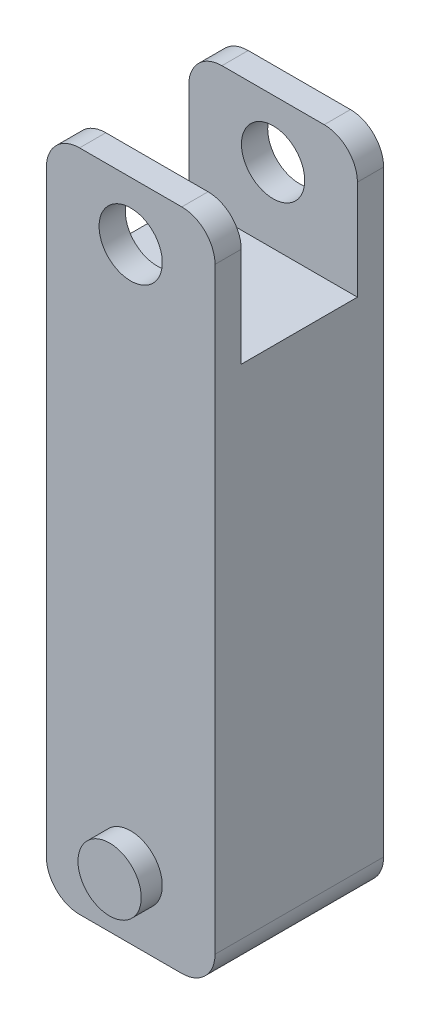
ISO-10303-21;
HEADER;
FILE_DESCRIPTION(('STEP AP214'),'2;1');
FILE_NAME('part.step','',(''),(''),'','','');
FILE_SCHEMA(('AUTOMOTIVE_DESIGN { 1 0 10303 214 1 1 1 1 }'));
ENDSEC;
DATA;
#1=APPLICATION_CONTEXT('core data for automotive mechanical design processes');
#2=APPLICATION_PROTOCOL_DEFINITION('international standard','automotive_design',2000,#1);
#3=PRODUCT_CONTEXT('',#1,'mechanical');
#4=PRODUCT('Part','Part','',(#3));
#5=PRODUCT_RELATED_PRODUCT_CATEGORY('part','',(#4));
#6=PRODUCT_DEFINITION_FORMATION('','',#4);
#7=PRODUCT_DEFINITION_CONTEXT('part definition',#1,'design');
#8=PRODUCT_DEFINITION('design','',#6,#7);
#9=PRODUCT_DEFINITION_SHAPE('','',#8);
#10=(LENGTH_UNIT() NAMED_UNIT(*) SI_UNIT(.MILLI.,.METRE.));
#11=(NAMED_UNIT(*) PLANE_ANGLE_UNIT() SI_UNIT($,.RADIAN.));
#12=(NAMED_UNIT(*) SI_UNIT($,.STERADIAN.) SOLID_ANGLE_UNIT());
#13=UNCERTAINTY_MEASURE_WITH_UNIT(LENGTH_MEASURE(1.E-05),#10,'distance_accuracy_value','');
#14=(GEOMETRIC_REPRESENTATION_CONTEXT(3) GLOBAL_UNCERTAINTY_ASSIGNED_CONTEXT((#13)) GLOBAL_UNIT_ASSIGNED_CONTEXT((#10,
#11,#12)) REPRESENTATION_CONTEXT('',''));
#15=CARTESIAN_POINT('',(0.,0.,0.));
#16=DIRECTION('',(0.,0.,1.));
#17=DIRECTION('',(1.,0.,0.));
#18=AXIS2_PLACEMENT_3D('',#15,#16,#17);
#19=CARTESIAN_POINT('',(0.,400.,0.));
#20=DIRECTION('',(0.,-1.,0.));
#21=DIRECTION('',(0.,0.,-1.));
#22=AXIS2_PLACEMENT_3D('',#19,#20,#21);
#23=PLANE('',#22);
#24=DIRECTION('',(-1.,0.,0.));
#25=VECTOR('',#24,1.);
#26=CARTESIAN_POINT('',(-50.8,400.,-50.8));
#27=LINE('',#26,#25);
#28=CARTESIAN_POINT('',(30.8,400.,-50.8));
#29=VERTEX_POINT('',#28);
#30=CARTESIAN_POINT('',(-30.8,400.,-50.8));
#31=VERTEX_POINT('',#30);
#32=EDGE_CURVE('E173',#29,#31,#27,.T.);
#33=ORIENTED_EDGE('',*,*,#32,.T.);
#34=DIRECTION('',(0.,0.,1.));
#35=VECTOR('',#34,1.);
#36=CARTESIAN_POINT('',(-30.8,400.,0.));
#37=LINE('',#36,#35);
#38=CARTESIAN_POINT('',(-30.8,400.,-35.));
#39=VERTEX_POINT('',#38);
#40=EDGE_CURVE('E243',#31,#39,#37,.T.);
#41=ORIENTED_EDGE('',*,*,#40,.T.);
#42=DIRECTION('',(1.,0.,0.));
#43=VECTOR('',#42,1.);
#44=CARTESIAN_POINT('',(-157.101458127347,400.,-35.));
#45=LINE('',#44,#43);
#46=CARTESIAN_POINT('',(30.8,400.,-35.));
#47=VERTEX_POINT('',#46);
#48=EDGE_CURVE('E156',#39,#47,#45,.T.);
#49=ORIENTED_EDGE('',*,*,#48,.T.);
#50=DIRECTION('',(0.,0.,-1.));
#51=VECTOR('',#50,1.);
#52=CARTESIAN_POINT('',(30.8,400.,0.));
#53=LINE('',#52,#51);
#54=EDGE_CURVE('E240',#47,#29,#53,.T.);
#55=ORIENTED_EDGE('',*,*,#54,.T.);
#56=EDGE_LOOP('',(#33,#41,#49,#55));
#57=FACE_BOUND('',#56,.T.);
#58=ADVANCED_FACE('F33',(#57),#23,.F.);
#59=CARTESIAN_POINT('',(50.8,400.,50.8));
#60=DIRECTION('',(-1.,0.,0.));
#61=DIRECTION('',(0.,0.,1.));
#62=AXIS2_PLACEMENT_3D('',#59,#60,#61);
#63=PLANE('',#62);
#64=DIRECTION('',(0.,-1.,0.));
#65=VECTOR('',#64,1.);
#66=CARTESIAN_POINT('',(50.8,320.,35.));
#67=LINE('',#66,#65);
#68=CARTESIAN_POINT('',(50.8,380.,35.));
#69=VERTEX_POINT('',#68);
#70=CARTESIAN_POINT('',(50.8,320.,35.));
#71=VERTEX_POINT('',#70);
#72=EDGE_CURVE('E133',#69,#71,#67,.T.);
#73=ORIENTED_EDGE('',*,*,#72,.F.);
#74=DIRECTION('',(0.,0.,-1.));
#75=VECTOR('',#74,1.);
#76=CARTESIAN_POINT('',(50.8,380.,50.8));
#77=LINE('',#76,#75);
#78=CARTESIAN_POINT('',(50.8,380.,50.8));
#79=VERTEX_POINT('',#78);
#80=EDGE_CURVE('E11',#69,#79,#77,.F.);
#81=ORIENTED_EDGE('',*,*,#80,.T.);
#82=DIRECTION('',(0.,-1.,0.));
#83=VECTOR('',#82,1.);
#84=CARTESIAN_POINT('',(50.8,400.,50.8));
#85=LINE('',#84,#83);
#86=CARTESIAN_POINT('',(50.8,20.,50.8));
#87=VERTEX_POINT('',#86);
#88=EDGE_CURVE('E180',#79,#87,#85,.T.);
#89=ORIENTED_EDGE('',*,*,#88,.T.);
#90=DIRECTION('',(0.,0.,-1.));
#91=VECTOR('',#90,1.);
#92=CARTESIAN_POINT('',(50.8,20.,-50.8));
#93=LINE('',#92,#91);
#94=CARTESIAN_POINT('',(50.8,20.,-50.8));
#95=VERTEX_POINT('',#94);
#96=EDGE_CURVE('E215',#87,#95,#93,.T.);
#97=ORIENTED_EDGE('',*,*,#96,.T.);
#98=DIRECTION('',(0.,-1.,0.));
#99=VECTOR('',#98,1.);
#100=CARTESIAN_POINT('',(50.8,400.,-50.8));
#101=LINE('',#100,#99);
#102=CARTESIAN_POINT('',(50.8,380.,-50.8));
#103=VERTEX_POINT('',#102);
#104=EDGE_CURVE('E190',#103,#95,#101,.T.);
#105=ORIENTED_EDGE('',*,*,#104,.F.);
#106=DIRECTION('',(0.,0.,-1.));
#107=VECTOR('',#106,1.);
#108=CARTESIAN_POINT('',(50.8,380.,50.8));
#109=LINE('',#108,#107);
#110=CARTESIAN_POINT('',(50.8,380.,-35.));
#111=VERTEX_POINT('',#110);
#112=EDGE_CURVE('E41',#103,#111,#109,.F.);
#113=ORIENTED_EDGE('',*,*,#112,.T.);
#114=DIRECTION('',(0.,1.,0.));
#115=VECTOR('',#114,1.);
#116=CARTESIAN_POINT('',(50.8,320.,-35.));
#117=LINE('',#116,#115);
#118=CARTESIAN_POINT('',(50.8,320.,-35.));
#119=VERTEX_POINT('',#118);
#120=EDGE_CURVE('E144',#119,#111,#117,.T.);
#121=ORIENTED_EDGE('',*,*,#120,.F.);
#122=DIRECTION('',(0.,0.,-1.));
#123=VECTOR('',#122,1.);
#124=CARTESIAN_POINT('',(50.8,320.,35.));
#125=LINE('',#124,#123);
#126=EDGE_CURVE('E143',#71,#119,#125,.T.);
#127=ORIENTED_EDGE('',*,*,#126,.F.);
#128=EDGE_LOOP('',(#73,#81,#89,#97,#105,#113,#121,#127));
#129=FACE_BOUND('',#128,.T.);
#130=ADVANCED_FACE('F155',(#129),#63,.F.);
#131=CARTESIAN_POINT('',(-50.8,400.,-50.8));
#132=DIRECTION('',(0.,0.,1.));
#133=DIRECTION('',(1.,0.,0.));
#134=AXIS2_PLACEMENT_3D('',#131,#132,#133);
#135=PLANE('',#134);
#136=CARTESIAN_POINT('',(0.,365.,-50.8));
#137=DIRECTION('',(0.,0.,-1.));
#138=DIRECTION('',(-1.,0.,0.));
#139=AXIS2_PLACEMENT_3D('',#136,#137,#138);
#140=CIRCLE('',#139,19.05);
#141=CARTESIAN_POINT('',(-19.05,365.,-50.8));
#142=VERTEX_POINT('',#141);
#143=EDGE_CURVE('E353',#142,#142,#140,.T.);
#144=ORIENTED_EDGE('',*,*,#143,.F.);
#145=EDGE_LOOP('',(#144));
#146=FACE_BOUND('',#145,.T.);
#147=CARTESIAN_POINT('',(0.,40.,-50.8));
#148=DIRECTION('',(0.,0.,1.));
#149=DIRECTION('',(1.,0.,0.));
#150=AXIS2_PLACEMENT_3D('',#147,#148,#149);
#151=CIRCLE('',#150,19.05);
#152=CARTESIAN_POINT('',(19.05,40.,-50.8));
#153=VERTEX_POINT('',#152);
#154=EDGE_CURVE('E195',#153,#153,#151,.F.);
#155=ORIENTED_EDGE('',*,*,#154,.F.);
#156=EDGE_LOOP('',(#155));
#157=FACE_BOUND('',#156,.T.);
#158=DIRECTION('',(0.,-1.,0.));
#159=VECTOR('',#158,1.);
#160=CARTESIAN_POINT('',(-50.8,400.,-50.8));
#161=LINE('',#160,#159);
#162=CARTESIAN_POINT('',(-50.8,380.,-50.8));
#163=VERTEX_POINT('',#162);
#164=CARTESIAN_POINT('',(-50.8,20.,-50.8));
#165=VERTEX_POINT('',#164);
#166=EDGE_CURVE('E188',#163,#165,#161,.T.);
#167=ORIENTED_EDGE('',*,*,#166,.F.);
#168=CARTESIAN_POINT('',(-30.8,380.,-50.8));
#169=DIRECTION('',(0.,0.,1.));
#170=DIRECTION('',(1.,0.,0.));
#171=AXIS2_PLACEMENT_3D('',#168,#169,#170);
#172=CIRCLE('',#171,20.);
#173=EDGE_CURVE('E251',#163,#31,#172,.F.);
#174=ORIENTED_EDGE('',*,*,#173,.T.);
#175=ORIENTED_EDGE('',*,*,#32,.F.);
#176=CARTESIAN_POINT('',(30.8,380.,-50.8));
#177=DIRECTION('',(0.,0.,1.));
#178=DIRECTION('',(1.,0.,0.));
#179=AXIS2_PLACEMENT_3D('',#176,#177,#178);
#180=CIRCLE('',#179,20.);
#181=EDGE_CURVE('E48',#29,#103,#180,.F.);
#182=ORIENTED_EDGE('',*,*,#181,.T.);
#183=ORIENTED_EDGE('',*,*,#104,.T.);
#184=CARTESIAN_POINT('',(30.8,20.,-50.8));
#185=DIRECTION('',(0.,0.,1.));
#186=DIRECTION('',(1.,0.,0.));
#187=AXIS2_PLACEMENT_3D('',#184,#185,#186);
#188=CIRCLE('',#187,20.);
#189=CARTESIAN_POINT('',(30.8,0.,-50.8));
#190=VERTEX_POINT('',#189);
#191=EDGE_CURVE('E210',#95,#190,#188,.F.);
#192=ORIENTED_EDGE('',*,*,#191,.T.);
#193=DIRECTION('',(-1.,0.,0.));
#194=VECTOR('',#193,1.);
#195=CARTESIAN_POINT('',(-50.8,0.,-50.8));
#196=LINE('',#195,#194);
#197=CARTESIAN_POINT('',(-30.8,0.,-50.8));
#198=VERTEX_POINT('',#197);
#199=EDGE_CURVE('E172',#190,#198,#196,.T.);
#200=ORIENTED_EDGE('',*,*,#199,.T.);
#201=CARTESIAN_POINT('',(-30.8,20.,-50.8));
#202=DIRECTION('',(0.,0.,1.));
#203=DIRECTION('',(1.,0.,0.));
#204=AXIS2_PLACEMENT_3D('',#201,#202,#203);
#205=CIRCLE('',#204,20.);
#206=EDGE_CURVE('E212',#198,#165,#205,.F.);
#207=ORIENTED_EDGE('',*,*,#206,.T.);
#208=EDGE_LOOP('',(#167,#174,#175,#182,#183,#192,#200,#207));
#209=FACE_BOUND('',#208,.T.);
#210=ADVANCED_FACE('F254',(#146,#157,#209),#135,.F.);
#211=CARTESIAN_POINT('',(-50.8,400.,50.8));
#212=DIRECTION('',(1.,0.,0.));
#213=DIRECTION('',(0.,0.,-1.));
#214=AXIS2_PLACEMENT_3D('',#211,#212,#213);
#215=PLANE('',#214);
#216=DIRECTION('',(0.,-1.,0.));
#217=VECTOR('',#216,1.);
#218=CARTESIAN_POINT('',(-50.8,400.,50.8));
#219=LINE('',#218,#217);
#220=CARTESIAN_POINT('',(-50.8,380.,50.8));
#221=VERTEX_POINT('',#220);
#222=CARTESIAN_POINT('',(-50.8,20.,50.8));
#223=VERTEX_POINT('',#222);
#224=EDGE_CURVE('E186',#221,#223,#219,.T.);
#225=ORIENTED_EDGE('',*,*,#224,.F.);
#226=DIRECTION('',(0.,0.,1.));
#227=VECTOR('',#226,1.);
#228=CARTESIAN_POINT('',(-50.8,380.,50.8));
#229=LINE('',#228,#227);
#230=CARTESIAN_POINT('',(-50.8,380.,35.));
#231=VERTEX_POINT('',#230);
#232=EDGE_CURVE('E235',#221,#231,#229,.F.);
#233=ORIENTED_EDGE('',*,*,#232,.T.);
#234=DIRECTION('',(0.,1.,0.));
#235=VECTOR('',#234,1.);
#236=CARTESIAN_POINT('',(-50.8,320.,35.));
#237=LINE('',#236,#235);
#238=CARTESIAN_POINT('',(-50.8,320.,35.));
#239=VERTEX_POINT('',#238);
#240=EDGE_CURVE('E162',#239,#231,#237,.T.);
#241=ORIENTED_EDGE('',*,*,#240,.F.);
#242=DIRECTION('',(0.,0.,1.));
#243=VECTOR('',#242,1.);
#244=CARTESIAN_POINT('',(-50.8,320.,35.));
#245=LINE('',#244,#243);
#246=CARTESIAN_POINT('',(-50.8,320.,-35.));
#247=VERTEX_POINT('',#246);
#248=EDGE_CURVE('E151',#247,#239,#245,.T.);
#249=ORIENTED_EDGE('',*,*,#248,.F.);
#250=DIRECTION('',(0.,-1.,0.));
#251=VECTOR('',#250,1.);
#252=CARTESIAN_POINT('',(-50.8,320.,-35.));
#253=LINE('',#252,#251);
#254=CARTESIAN_POINT('',(-50.8,380.,-35.));
#255=VERTEX_POINT('',#254);
#256=EDGE_CURVE('E169',#255,#247,#253,.T.);
#257=ORIENTED_EDGE('',*,*,#256,.F.);
#258=DIRECTION('',(0.,0.,1.));
#259=VECTOR('',#258,1.);
#260=CARTESIAN_POINT('',(-50.8,380.,50.8));
#261=LINE('',#260,#259);
#262=EDGE_CURVE('E233',#255,#163,#261,.F.);
#263=ORIENTED_EDGE('',*,*,#262,.T.);
#264=ORIENTED_EDGE('',*,*,#166,.T.);
#265=DIRECTION('',(0.,0.,1.));
#266=VECTOR('',#265,1.);
#267=CARTESIAN_POINT('',(-50.8,20.,50.8));
#268=LINE('',#267,#266);
#269=EDGE_CURVE('E198',#165,#223,#268,.T.);
#270=ORIENTED_EDGE('',*,*,#269,.T.);
#271=EDGE_LOOP('',(#225,#233,#241,#249,#257,#263,#264,#270));
#272=FACE_BOUND('',#271,.T.);
#273=ADVANCED_FACE('F267',(#272),#215,.F.);
#274=CARTESIAN_POINT('',(-50.8,400.,50.8));
#275=DIRECTION('',(0.,0.,-1.));
#276=DIRECTION('',(-1.,0.,0.));
#277=AXIS2_PLACEMENT_3D('',#274,#275,#276);
#278=PLANE('',#277);
#279=CARTESIAN_POINT('',(0.,365.,50.8));
#280=DIRECTION('',(0.,0.,-1.));
#281=DIRECTION('',(-1.,0.,0.));
#282=AXIS2_PLACEMENT_3D('',#279,#280,#281);
#283=CIRCLE('',#282,19.05);
#284=CARTESIAN_POINT('',(-19.05,365.,50.8));
#285=VERTEX_POINT('',#284);
#286=EDGE_CURVE('E223',#285,#285,#283,.F.);
#287=ORIENTED_EDGE('',*,*,#286,.F.);
#288=EDGE_LOOP('',(#287));
#289=FACE_BOUND('',#288,.T.);
#290=CARTESIAN_POINT('',(0.,40.,50.8));
#291=DIRECTION('',(0.,0.,-1.));
#292=DIRECTION('',(-1.,0.,0.));
#293=AXIS2_PLACEMENT_3D('',#290,#291,#292);
#294=CIRCLE('',#293,19.05);
#295=CARTESIAN_POINT('',(-19.05,40.,50.8));
#296=VERTEX_POINT('',#295);
#297=EDGE_CURVE('E192',#296,#296,#294,.F.);
#298=ORIENTED_EDGE('',*,*,#297,.F.);
#299=EDGE_LOOP('',(#298));
#300=FACE_BOUND('',#299,.T.);
#301=DIRECTION('',(1.,0.,0.));
#302=VECTOR('',#301,1.);
#303=CARTESIAN_POINT('',(-50.8,400.,50.8));
#304=LINE('',#303,#302);
#305=CARTESIAN_POINT('',(-30.8,400.,50.8));
#306=VERTEX_POINT('',#305);
#307=CARTESIAN_POINT('',(30.8,400.,50.8));
#308=VERTEX_POINT('',#307);
#309=EDGE_CURVE('E176',#306,#308,#304,.T.);
#310=ORIENTED_EDGE('',*,*,#309,.F.);
#311=CARTESIAN_POINT('',(-30.8,380.,50.8));
#312=DIRECTION('',(0.,0.,-1.));
#313=DIRECTION('',(-1.,0.,0.));
#314=AXIS2_PLACEMENT_3D('',#311,#312,#313);
#315=CIRCLE('',#314,20.);
#316=EDGE_CURVE('E231',#306,#221,#315,.F.);
#317=ORIENTED_EDGE('',*,*,#316,.T.);
#318=ORIENTED_EDGE('',*,*,#224,.T.);
#319=CARTESIAN_POINT('',(-30.8,20.,50.8));
#320=DIRECTION('',(0.,0.,-1.));
#321=DIRECTION('',(-1.,0.,0.));
#322=AXIS2_PLACEMENT_3D('',#319,#320,#321);
#323=CIRCLE('',#322,20.);
#324=CARTESIAN_POINT('',(-30.8,0.,50.8));
#325=VERTEX_POINT('',#324);
#326=EDGE_CURVE('E204',#223,#325,#323,.F.);
#327=ORIENTED_EDGE('',*,*,#326,.T.);
#328=DIRECTION('',(1.,0.,0.));
#329=VECTOR('',#328,1.);
#330=CARTESIAN_POINT('',(-50.8,0.,50.8));
#331=LINE('',#330,#329);
#332=CARTESIAN_POINT('',(30.8,0.,50.8));
#333=VERTEX_POINT('',#332);
#334=EDGE_CURVE('E177',#325,#333,#331,.T.);
#335=ORIENTED_EDGE('',*,*,#334,.T.);
#336=CARTESIAN_POINT('',(30.8,20.,50.8));
#337=DIRECTION('',(0.,0.,-1.));
#338=DIRECTION('',(-1.,0.,0.));
#339=AXIS2_PLACEMENT_3D('',#336,#337,#338);
#340=CIRCLE('',#339,20.);
#341=EDGE_CURVE('E201',#333,#87,#340,.F.);
#342=ORIENTED_EDGE('',*,*,#341,.T.);
#343=ORIENTED_EDGE('',*,*,#88,.F.);
#344=CARTESIAN_POINT('',(30.8,380.,50.8));
#345=DIRECTION('',(0.,0.,-1.));
#346=DIRECTION('',(-1.,0.,0.));
#347=AXIS2_PLACEMENT_3D('',#344,#345,#346);
#348=CIRCLE('',#347,20.);
#349=EDGE_CURVE('E229',#79,#308,#348,.F.);
#350=ORIENTED_EDGE('',*,*,#349,.T.);
#351=EDGE_LOOP('',(#310,#317,#318,#327,#335,#342,#343,#350));
#352=FACE_BOUND('',#351,.T.);
#353=ADVANCED_FACE('F289',(#289,#300,#352),#278,.F.);
#354=DIRECTION('',(1.,0.,0.));
#355=VECTOR('',#354,1.);
#356=CARTESIAN_POINT('',(-157.101458127347,400.,35.));
#357=LINE('',#356,#355);
#358=CARTESIAN_POINT('',(-30.8,400.,35.));
#359=VERTEX_POINT('',#358);
#360=CARTESIAN_POINT('',(30.8,400.,35.));
#361=VERTEX_POINT('',#360);
#362=EDGE_CURVE('E153',#359,#361,#357,.T.);
#363=ORIENTED_EDGE('',*,*,#362,.F.);
#364=DIRECTION('',(0.,0.,1.));
#365=VECTOR('',#364,1.);
#366=CARTESIAN_POINT('',(-30.8,400.,0.));
#367=LINE('',#366,#365);
#368=EDGE_CURVE('E226',#359,#306,#367,.T.);
#369=ORIENTED_EDGE('',*,*,#368,.T.);
#370=ORIENTED_EDGE('',*,*,#309,.T.);
#371=DIRECTION('',(0.,0.,-1.));
#372=VECTOR('',#371,1.);
#373=CARTESIAN_POINT('',(30.8,400.,0.));
#374=LINE('',#373,#372);
#375=EDGE_CURVE('E218',#308,#361,#374,.T.);
#376=ORIENTED_EDGE('',*,*,#375,.T.);
#377=EDGE_LOOP('',(#363,#369,#370,#376));
#378=FACE_BOUND('',#377,.T.);
#379=ADVANCED_FACE('F286',(#378),#23,.F.);
#380=CARTESIAN_POINT('',(0.,0.,0.));
#381=DIRECTION('',(0.,-1.,0.));
#382=DIRECTION('',(0.,0.,-1.));
#383=AXIS2_PLACEMENT_3D('',#380,#381,#382);
#384=PLANE('',#383);
#385=ORIENTED_EDGE('',*,*,#334,.F.);
#386=DIRECTION('',(0.,0.,1.));
#387=VECTOR('',#386,1.);
#388=CARTESIAN_POINT('',(-30.8,0.,-50.8));
#389=LINE('',#388,#387);
#390=EDGE_CURVE('E208',#325,#198,#389,.F.);
#391=ORIENTED_EDGE('',*,*,#390,.T.);
#392=ORIENTED_EDGE('',*,*,#199,.F.);
#393=DIRECTION('',(0.,0.,-1.));
#394=VECTOR('',#393,1.);
#395=CARTESIAN_POINT('',(30.8,0.,50.8));
#396=LINE('',#395,#394);
#397=EDGE_CURVE('E206',#190,#333,#396,.F.);
#398=ORIENTED_EDGE('',*,*,#397,.T.);
#399=EDGE_LOOP('',(#385,#391,#392,#398));
#400=FACE_BOUND('',#399,.T.);
#401=ADVANCED_FACE('F304',(#400),#384,.T.);
#402=CARTESIAN_POINT('',(0.,40.,63.5));
#403=DIRECTION('',(0.,0.,-1.));
#404=DIRECTION('',(-1.,0.,0.));
#405=AXIS2_PLACEMENT_3D('',#402,#403,#404);
#406=CYLINDRICAL_SURFACE('',#405,19.05);
#407=CARTESIAN_POINT('',(0.,40.,63.5));
#408=DIRECTION('',(0.,0.,1.));
#409=DIRECTION('',(1.,0.,0.));
#410=AXIS2_PLACEMENT_3D('',#407,#408,#409);
#411=CIRCLE('',#410,19.05);
#412=CARTESIAN_POINT('',(19.05,40.,63.5));
#413=VERTEX_POINT('',#412);
#414=EDGE_CURVE('E168',#413,#413,#411,.T.);
#415=ORIENTED_EDGE('',*,*,#414,.F.);
#416=EDGE_LOOP('',(#415));
#417=FACE_BOUND('',#416,.T.);
#418=ORIENTED_EDGE('',*,*,#297,.T.);
#419=EDGE_LOOP('',(#418));
#420=FACE_BOUND('',#419,.T.);
#421=ADVANCED_FACE('F336',(#417,#420),#406,.T.);
#422=CARTESIAN_POINT('',(0.,40.,63.5));
#423=DIRECTION('',(0.,0.,1.));
#424=DIRECTION('',(1.,0.,0.));
#425=AXIS2_PLACEMENT_3D('',#422,#423,#424);
#426=PLANE('',#425);
#427=ORIENTED_EDGE('',*,*,#414,.T.);
#428=EDGE_LOOP('',(#427));
#429=FACE_BOUND('',#428,.T.);
#430=ADVANCED_FACE('F357',(#429),#426,.T.);
#431=CARTESIAN_POINT('',(0.,40.,-63.5));
#432=DIRECTION('',(0.,0.,1.));
#433=DIRECTION('',(1.,0.,0.));
#434=AXIS2_PLACEMENT_3D('',#431,#432,#433);
#435=CYLINDRICAL_SURFACE('',#434,19.05);
#436=CARTESIAN_POINT('',(0.,40.,-63.5));
#437=DIRECTION('',(0.,0.,-1.));
#438=DIRECTION('',(-1.,0.,0.));
#439=AXIS2_PLACEMENT_3D('',#436,#437,#438);
#440=CIRCLE('',#439,19.05);
#441=CARTESIAN_POINT('',(-19.05,40.,-63.5));
#442=VERTEX_POINT('',#441);
#443=EDGE_CURVE('E165',#442,#442,#440,.T.);
#444=ORIENTED_EDGE('',*,*,#443,.F.);
#445=EDGE_LOOP('',(#444));
#446=FACE_BOUND('',#445,.T.);
#447=ORIENTED_EDGE('',*,*,#154,.T.);
#448=EDGE_LOOP('',(#447));
#449=FACE_BOUND('',#448,.T.);
#450=ADVANCED_FACE('F318',(#446,#449),#435,.T.);
#451=CARTESIAN_POINT('',(0.,40.,-63.5));
#452=DIRECTION('',(0.,0.,-1.));
#453=DIRECTION('',(-1.,0.,0.));
#454=AXIS2_PLACEMENT_3D('',#451,#452,#453);
#455=PLANE('',#454);
#456=ORIENTED_EDGE('',*,*,#443,.T.);
#457=EDGE_LOOP('',(#456));
#458=FACE_BOUND('',#457,.T.);
#459=ADVANCED_FACE('F311',(#458),#455,.T.);
#460=CARTESIAN_POINT('',(-30.8,20.,50.8));
#461=DIRECTION('',(0.,0.,-1.));
#462=DIRECTION('',(-1.,0.,0.));
#463=AXIS2_PLACEMENT_3D('',#460,#461,#462);
#464=CYLINDRICAL_SURFACE('',#463,20.);
#465=ORIENTED_EDGE('',*,*,#206,.F.);
#466=ORIENTED_EDGE('',*,*,#390,.F.);
#467=ORIENTED_EDGE('',*,*,#326,.F.);
#468=ORIENTED_EDGE('',*,*,#269,.F.);
#469=EDGE_LOOP('',(#465,#466,#467,#468));
#470=FACE_BOUND('',#469,.T.);
#471=ADVANCED_FACE('F308',(#470),#464,.T.);
#472=CARTESIAN_POINT('',(30.8,20.,50.8));
#473=DIRECTION('',(0.,0.,1.));
#474=DIRECTION('',(1.,0.,0.));
#475=AXIS2_PLACEMENT_3D('',#472,#473,#474);
#476=CYLINDRICAL_SURFACE('',#475,20.);
#477=ORIENTED_EDGE('',*,*,#341,.F.);
#478=ORIENTED_EDGE('',*,*,#397,.F.);
#479=ORIENTED_EDGE('',*,*,#191,.F.);
#480=ORIENTED_EDGE('',*,*,#96,.F.);
#481=EDGE_LOOP('',(#477,#478,#479,#480));
#482=FACE_BOUND('',#481,.T.);
#483=ADVANCED_FACE('F300',(#482),#476,.T.);
#484=CARTESIAN_POINT('',(-157.101458127347,320.,-35.));
#485=DIRECTION('',(0.,0.,-1.));
#486=DIRECTION('',(-1.,0.,0.));
#487=AXIS2_PLACEMENT_3D('',#484,#485,#486);
#488=PLANE('',#487);
#489=CARTESIAN_POINT('',(0.,365.,-35.));
#490=DIRECTION('',(0.,0.,-1.));
#491=DIRECTION('',(-1.,0.,0.));
#492=AXIS2_PLACEMENT_3D('',#489,#490,#491);
#493=CIRCLE('',#492,19.05);
#494=CARTESIAN_POINT('',(-19.05,365.,-35.));
#495=VERTEX_POINT('',#494);
#496=EDGE_CURVE('E222',#495,#495,#493,.T.);
#497=ORIENTED_EDGE('',*,*,#496,.T.);
#498=EDGE_LOOP('',(#497));
#499=FACE_BOUND('',#498,.T.);
#500=ORIENTED_EDGE('',*,*,#48,.F.);
#501=CARTESIAN_POINT('',(-30.8,380.,-35.));
#502=DIRECTION('',(0.,0.,-1.));
#503=DIRECTION('',(-1.,0.,0.));
#504=AXIS2_PLACEMENT_3D('',#501,#502,#503);
#505=CIRCLE('',#504,20.);
#506=EDGE_CURVE('E248',#39,#255,#505,.F.);
#507=ORIENTED_EDGE('',*,*,#506,.T.);
#508=ORIENTED_EDGE('',*,*,#256,.T.);
#509=DIRECTION('',(1.,0.,0.));
#510=VECTOR('',#509,1.);
#511=CARTESIAN_POINT('',(-157.101458127347,320.,-35.));
#512=LINE('',#511,#510);
#513=EDGE_CURVE('E152',#247,#119,#512,.T.);
#514=ORIENTED_EDGE('',*,*,#513,.T.);
#515=ORIENTED_EDGE('',*,*,#120,.T.);
#516=CARTESIAN_POINT('',(30.8,380.,-35.));
#517=DIRECTION('',(0.,0.,-1.));
#518=DIRECTION('',(-1.,0.,0.));
#519=AXIS2_PLACEMENT_3D('',#516,#517,#518);
#520=CIRCLE('',#519,20.);
#521=EDGE_CURVE('E246',#111,#47,#520,.F.);
#522=ORIENTED_EDGE('',*,*,#521,.T.);
#523=EDGE_LOOP('',(#500,#507,#508,#514,#515,#522));
#524=FACE_BOUND('',#523,.T.);
#525=ADVANCED_FACE('F264',(#499,#524),#488,.F.);
#526=CARTESIAN_POINT('',(-157.101458127347,320.,35.));
#527=DIRECTION('',(0.,-1.,0.));
#528=DIRECTION('',(0.,0.,-1.));
#529=AXIS2_PLACEMENT_3D('',#526,#527,#528);
#530=PLANE('',#529);
#531=ORIENTED_EDGE('',*,*,#248,.T.);
#532=DIRECTION('',(1.,0.,0.));
#533=VECTOR('',#532,1.);
#534=CARTESIAN_POINT('',(-157.101458127347,320.,35.));
#535=LINE('',#534,#533);
#536=EDGE_CURVE('E137',#239,#71,#535,.T.);
#537=ORIENTED_EDGE('',*,*,#536,.T.);
#538=ORIENTED_EDGE('',*,*,#126,.T.);
#539=ORIENTED_EDGE('',*,*,#513,.F.);
#540=EDGE_LOOP('',(#531,#537,#538,#539));
#541=FACE_BOUND('',#540,.T.);
#542=ADVANCED_FACE('F148',(#541),#530,.F.);
#543=CARTESIAN_POINT('',(-157.101458127347,320.,35.));
#544=DIRECTION('',(0.,0.,1.));
#545=DIRECTION('',(1.,0.,0.));
#546=AXIS2_PLACEMENT_3D('',#543,#544,#545);
#547=PLANE('',#546);
#548=CARTESIAN_POINT('',(0.,365.,35.));
#549=DIRECTION('',(0.,0.,1.));
#550=DIRECTION('',(1.,0.,0.));
#551=AXIS2_PLACEMENT_3D('',#548,#549,#550);
#552=CIRCLE('',#551,19.05);
#553=CARTESIAN_POINT('',(19.05,365.,35.));
#554=VERTEX_POINT('',#553);
#555=EDGE_CURVE('E219',#554,#554,#552,.T.);
#556=ORIENTED_EDGE('',*,*,#555,.T.);
#557=EDGE_LOOP('',(#556));
#558=FACE_BOUND('',#557,.T.);
#559=ORIENTED_EDGE('',*,*,#240,.T.);
#560=CARTESIAN_POINT('',(-30.8,380.,35.));
#561=DIRECTION('',(0.,0.,1.));
#562=DIRECTION('',(1.,0.,0.));
#563=AXIS2_PLACEMENT_3D('',#560,#561,#562);
#564=CIRCLE('',#563,20.);
#565=EDGE_CURVE('E238',#231,#359,#564,.F.);
#566=ORIENTED_EDGE('',*,*,#565,.T.);
#567=ORIENTED_EDGE('',*,*,#362,.T.);
#568=CARTESIAN_POINT('',(30.8,380.,35.));
#569=DIRECTION('',(0.,0.,1.));
#570=DIRECTION('',(1.,0.,0.));
#571=AXIS2_PLACEMENT_3D('',#568,#569,#570);
#572=CIRCLE('',#571,20.);
#573=EDGE_CURVE('E140',#361,#69,#572,.F.);
#574=ORIENTED_EDGE('',*,*,#573,.T.);
#575=ORIENTED_EDGE('',*,*,#72,.T.);
#576=ORIENTED_EDGE('',*,*,#536,.F.);
#577=EDGE_LOOP('',(#559,#566,#567,#574,#575,#576));
#578=FACE_BOUND('',#577,.T.);
#579=ADVANCED_FACE('F136',(#558,#578),#547,.F.);
#580=CARTESIAN_POINT('',(0.,365.,104.681536726415));
#581=DIRECTION('',(0.,0.,-1.));
#582=DIRECTION('',(-1.,0.,0.));
#583=AXIS2_PLACEMENT_3D('',#580,#581,#582);
#584=CYLINDRICAL_SURFACE('',#583,19.05);
#585=ORIENTED_EDGE('',*,*,#286,.T.);
#586=EDGE_LOOP('',(#585));
#587=FACE_BOUND('',#586,.T.);
#588=ORIENTED_EDGE('',*,*,#555,.F.);
#589=EDGE_LOOP('',(#588));
#590=FACE_BOUND('',#589,.T.);
#591=ADVANCED_FACE('F423',(#587,#590),#584,.F.);
#592=ORIENTED_EDGE('',*,*,#143,.T.);
#593=EDGE_LOOP('',(#592));
#594=FACE_BOUND('',#593,.T.);
#595=ORIENTED_EDGE('',*,*,#496,.F.);
#596=EDGE_LOOP('',(#595));
#597=FACE_BOUND('',#596,.T.);
#598=ADVANCED_FACE('F427',(#594,#597),#584,.F.);
#599=CARTESIAN_POINT('',(-30.8,380.,0.));
#600=DIRECTION('',(0.,0.,1.));
#601=DIRECTION('',(1.,0.,0.));
#602=AXIS2_PLACEMENT_3D('',#599,#600,#601);
#603=CYLINDRICAL_SURFACE('',#602,20.);
#604=ORIENTED_EDGE('',*,*,#565,.F.);
#605=ORIENTED_EDGE('',*,*,#232,.F.);
#606=ORIENTED_EDGE('',*,*,#316,.F.);
#607=ORIENTED_EDGE('',*,*,#368,.F.);
#608=EDGE_LOOP('',(#604,#605,#606,#607));
#609=FACE_BOUND('',#608,.T.);
#610=ADVANCED_FACE('F283',(#609),#603,.T.);
#611=CARTESIAN_POINT('',(-30.8,380.,0.));
#612=DIRECTION('',(0.,0.,1.));
#613=DIRECTION('',(1.,0.,0.));
#614=AXIS2_PLACEMENT_3D('',#611,#612,#613);
#615=CYLINDRICAL_SURFACE('',#614,20.);
#616=ORIENTED_EDGE('',*,*,#173,.F.);
#617=ORIENTED_EDGE('',*,*,#262,.F.);
#618=ORIENTED_EDGE('',*,*,#506,.F.);
#619=ORIENTED_EDGE('',*,*,#40,.F.);
#620=EDGE_LOOP('',(#616,#617,#618,#619));
#621=FACE_BOUND('',#620,.T.);
#622=ADVANCED_FACE('F261',(#621),#615,.T.);
#623=CARTESIAN_POINT('',(30.8,380.,0.));
#624=DIRECTION('',(0.,0.,-1.));
#625=DIRECTION('',(-1.,0.,0.));
#626=AXIS2_PLACEMENT_3D('',#623,#624,#625);
#627=CYLINDRICAL_SURFACE('',#626,20.);
#628=ORIENTED_EDGE('',*,*,#349,.F.);
#629=ORIENTED_EDGE('',*,*,#80,.F.);
#630=ORIENTED_EDGE('',*,*,#573,.F.);
#631=ORIENTED_EDGE('',*,*,#375,.F.);
#632=EDGE_LOOP('',(#628,#629,#630,#631));
#633=FACE_BOUND('',#632,.T.);
#634=ADVANCED_FACE('F293',(#633),#627,.T.);
#635=CARTESIAN_POINT('',(30.8,380.,0.));
#636=DIRECTION('',(0.,0.,-1.));
#637=DIRECTION('',(-1.,0.,0.));
#638=AXIS2_PLACEMENT_3D('',#635,#636,#637);
#639=CYLINDRICAL_SURFACE('',#638,20.);
#640=ORIENTED_EDGE('',*,*,#521,.F.);
#641=ORIENTED_EDGE('',*,*,#112,.F.);
#642=ORIENTED_EDGE('',*,*,#181,.F.);
#643=ORIENTED_EDGE('',*,*,#54,.F.);
#644=EDGE_LOOP('',(#640,#641,#642,#643));
#645=FACE_BOUND('',#644,.T.);
#646=ADVANCED_FACE('F35',(#645),#639,.T.);
#647=CLOSED_SHELL('',(#58,#130,#210,#273,#353,#379,#401,#421,#430,#450,#459,#471,#483,#525,#542,
#579,#591,#598,#610,#622,#634,#646));
#648=MANIFOLD_SOLID_BREP('B2',#647);
#649=ADVANCED_BREP_SHAPE_REPRESENTATION('',(#18,#648),#14);
#650=SHAPE_DEFINITION_REPRESENTATION(#9,#649);
ENDSEC;
END-ISO-10303-21;
